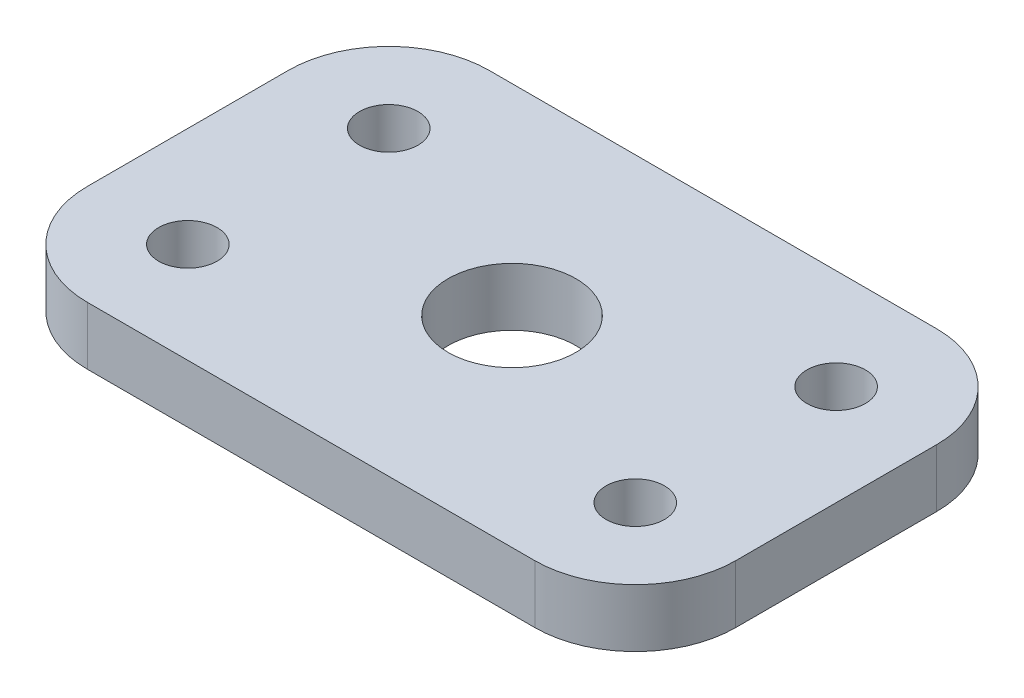
ISO-10303-21;
HEADER;
FILE_DESCRIPTION(('STEP AP214'),'2;1');
FILE_NAME('part.step','',(''),(''),'','','');
FILE_SCHEMA(('AUTOMOTIVE_DESIGN { 1 0 10303 214 1 1 1 1 }'));
ENDSEC;
DATA;
#1=APPLICATION_CONTEXT('core data for automotive mechanical design processes');
#2=APPLICATION_PROTOCOL_DEFINITION('international standard','automotive_design',2000,#1);
#3=PRODUCT_CONTEXT('',#1,'mechanical');
#4=PRODUCT('Part','Part','',(#3));
#5=PRODUCT_RELATED_PRODUCT_CATEGORY('part','',(#4));
#6=PRODUCT_DEFINITION_FORMATION('','',#4);
#7=PRODUCT_DEFINITION_CONTEXT('part definition',#1,'design');
#8=PRODUCT_DEFINITION('design','',#6,#7);
#9=PRODUCT_DEFINITION_SHAPE('','',#8);
#10=(LENGTH_UNIT() NAMED_UNIT(*) SI_UNIT(.MILLI.,.METRE.));
#11=(NAMED_UNIT(*) PLANE_ANGLE_UNIT() SI_UNIT($,.RADIAN.));
#12=(NAMED_UNIT(*) SI_UNIT($,.STERADIAN.) SOLID_ANGLE_UNIT());
#13=UNCERTAINTY_MEASURE_WITH_UNIT(LENGTH_MEASURE(1.E-05),#10,'distance_accuracy_value','');
#14=(GEOMETRIC_REPRESENTATION_CONTEXT(3) GLOBAL_UNCERTAINTY_ASSIGNED_CONTEXT((#13)) GLOBAL_UNIT_ASSIGNED_CONTEXT((#10,
#11,#12)) REPRESENTATION_CONTEXT('',''));
#15=CARTESIAN_POINT('',(0.,0.,0.));
#16=DIRECTION('',(0.,0.,1.));
#17=DIRECTION('',(1.,0.,0.));
#18=AXIS2_PLACEMENT_3D('',#15,#16,#17);
#19=CARTESIAN_POINT('',(0.,10.,0.));
#20=DIRECTION('',(0.,-1.,0.));
#21=DIRECTION('',(0.,0.,-1.));
#22=AXIS2_PLACEMENT_3D('',#19,#20,#21);
#23=PLANE('',#22);
#24=DIRECTION('',(1.,0.,0.));
#25=VECTOR('',#24,1.);
#26=CARTESIAN_POINT('',(-30.,10.,11.));
#27=LINE('',#26,#25);
#28=CARTESIAN_POINT('',(-24.5,10.,11.));
#29=VERTEX_POINT('',#28);
#30=CARTESIAN_POINT('',(0.,10.,11.));
#31=VERTEX_POINT('',#30);
#32=EDGE_CURVE('E145',#29,#31,#27,.T.);
#33=ORIENTED_EDGE('',*,*,#32,.T.);
#34=CARTESIAN_POINT('',(0.,10.,5.5));
#35=DIRECTION('',(0.,-1.,0.));
#36=DIRECTION('',(0.,0.,-1.));
#37=AXIS2_PLACEMENT_3D('',#34,#35,#36);
#38=CIRCLE('',#37,5.5);
#39=CARTESIAN_POINT('',(5.50000000000004,10.,5.5));
#40=VERTEX_POINT('',#39);
#41=EDGE_CURVE('E164',#31,#40,#38,.F.);
#42=ORIENTED_EDGE('',*,*,#41,.T.);
#43=DIRECTION('',(0.,0.,-1.));
#44=VECTOR('',#43,1.);
#45=CARTESIAN_POINT('',(5.50000000000004,10.,11.));
#46=LINE('',#45,#44);
#47=CARTESIAN_POINT('',(5.50000000000004,10.,-5.5));
#48=VERTEX_POINT('',#47);
#49=EDGE_CURVE('E128',#40,#48,#46,.T.);
#50=ORIENTED_EDGE('',*,*,#49,.T.);
#51=CARTESIAN_POINT('',(0.,10.,-5.5));
#52=DIRECTION('',(0.,-1.,0.));
#53=DIRECTION('',(0.,0.,-1.));
#54=AXIS2_PLACEMENT_3D('',#51,#52,#53);
#55=CIRCLE('',#54,5.5);
#56=CARTESIAN_POINT('',(0.,10.,-11.));
#57=VERTEX_POINT('',#56);
#58=EDGE_CURVE('E162',#48,#57,#55,.F.);
#59=ORIENTED_EDGE('',*,*,#58,.T.);
#60=DIRECTION('',(-1.,0.,0.));
#61=VECTOR('',#60,1.);
#62=CARTESIAN_POINT('',(-30.,10.,-11.));
#63=LINE('',#62,#61);
#64=CARTESIAN_POINT('',(-24.5,10.,-11.));
#65=VERTEX_POINT('',#64);
#66=EDGE_CURVE('E175',#57,#65,#63,.T.);
#67=ORIENTED_EDGE('',*,*,#66,.T.);
#68=CARTESIAN_POINT('',(-24.5,10.,-5.5));
#69=DIRECTION('',(0.,-1.,0.));
#70=DIRECTION('',(0.,0.,-1.));
#71=AXIS2_PLACEMENT_3D('',#68,#69,#70);
#72=CIRCLE('',#71,5.5);
#73=CARTESIAN_POINT('',(-30.,10.,-5.5));
#74=VERTEX_POINT('',#73);
#75=EDGE_CURVE('E63',#65,#74,#72,.F.);
#76=ORIENTED_EDGE('',*,*,#75,.T.);
#77=DIRECTION('',(0.,0.,1.));
#78=VECTOR('',#77,1.);
#79=CARTESIAN_POINT('',(-30.,10.,11.));
#80=LINE('',#79,#78);
#81=CARTESIAN_POINT('',(-30.,10.,5.5));
#82=VERTEX_POINT('',#81);
#83=EDGE_CURVE('E183',#74,#82,#80,.T.);
#84=ORIENTED_EDGE('',*,*,#83,.T.);
#85=CARTESIAN_POINT('',(-24.5,10.,5.5));
#86=DIRECTION('',(0.,-1.,0.));
#87=DIRECTION('',(0.,0.,-1.));
#88=AXIS2_PLACEMENT_3D('',#85,#86,#87);
#89=CIRCLE('',#88,5.5);
#90=EDGE_CURVE('E159',#82,#29,#89,.F.);
#91=ORIENTED_EDGE('',*,*,#90,.T.);
#92=EDGE_LOOP('',(#33,#42,#50,#59,#67,#76,#84,#91));
#93=FACE_BOUND('',#92,.T.);
#94=CARTESIAN_POINT('',(-24.5,10.,-5.49999999999962));
#95=DIRECTION('',(0.,1.,0.));
#96=DIRECTION('',(0.,0.,1.));
#97=AXIS2_PLACEMENT_3D('',#94,#95,#96);
#98=CIRCLE('',#97,1.6);
#99=CARTESIAN_POINT('',(-24.5,10.,-3.89999999999962));
#100=VERTEX_POINT('',#99);
#101=EDGE_CURVE('E136',#100,#100,#98,.T.);
#102=ORIENTED_EDGE('',*,*,#101,.F.);
#103=EDGE_LOOP('',(#102));
#104=FACE_BOUND('',#103,.T.);
#105=CARTESIAN_POINT('',(0.,10.,5.5));
#106=DIRECTION('',(0.,1.,0.));
#107=DIRECTION('',(0.,0.,1.));
#108=AXIS2_PLACEMENT_3D('',#105,#106,#107);
#109=CIRCLE('',#108,1.6);
#110=CARTESIAN_POINT('',(0.,10.,7.1));
#111=VERTEX_POINT('',#110);
#112=EDGE_CURVE('E190',#111,#111,#109,.T.);
#113=ORIENTED_EDGE('',*,*,#112,.F.);
#114=EDGE_LOOP('',(#113));
#115=FACE_BOUND('',#114,.T.);
#116=CARTESIAN_POINT('',(0.,10.,-5.5));
#117=DIRECTION('',(0.,1.,0.));
#118=DIRECTION('',(0.,0.,1.));
#119=AXIS2_PLACEMENT_3D('',#116,#117,#118);
#120=CIRCLE('',#119,1.6);
#121=CARTESIAN_POINT('',(0.,10.,-3.9));
#122=VERTEX_POINT('',#121);
#123=EDGE_CURVE('E195',#122,#122,#120,.T.);
#124=ORIENTED_EDGE('',*,*,#123,.F.);
#125=EDGE_LOOP('',(#124));
#126=FACE_BOUND('',#125,.T.);
#127=CARTESIAN_POINT('',(-24.5,10.,5.50000000000038));
#128=DIRECTION('',(0.,1.,0.));
#129=DIRECTION('',(0.,0.,1.));
#130=AXIS2_PLACEMENT_3D('',#127,#128,#129);
#131=CIRCLE('',#130,1.6);
#132=CARTESIAN_POINT('',(-24.5,10.,7.10000000000038));
#133=VERTEX_POINT('',#132);
#134=EDGE_CURVE('E201',#133,#133,#131,.T.);
#135=ORIENTED_EDGE('',*,*,#134,.F.);
#136=EDGE_LOOP('',(#135));
#137=FACE_BOUND('',#136,.T.);
#138=CARTESIAN_POINT('',(-12.25,10.,0.));
#139=DIRECTION('',(0.,1.,0.));
#140=DIRECTION('',(0.,0.,1.));
#141=AXIS2_PLACEMENT_3D('',#138,#139,#140);
#142=CIRCLE('',#141,3.5);
#143=CARTESIAN_POINT('',(-12.25,10.,3.5));
#144=VERTEX_POINT('',#143);
#145=EDGE_CURVE('E207',#144,#144,#142,.T.);
#146=ORIENTED_EDGE('',*,*,#145,.F.);
#147=EDGE_LOOP('',(#146));
#148=FACE_BOUND('',#147,.T.);
#149=ADVANCED_FACE('F42',(#93,#104,#115,#126,#137,#148),#23,.F.);
#150=CARTESIAN_POINT('',(0.,6.825,0.));
#151=DIRECTION('',(0.,-1.,0.));
#152=DIRECTION('',(0.,0.,-1.));
#153=AXIS2_PLACEMENT_3D('',#150,#151,#152);
#154=PLANE('',#153);
#155=CARTESIAN_POINT('',(-24.5,6.825,5.50000000000038));
#156=DIRECTION('',(0.,1.,0.));
#157=DIRECTION('',(0.,0.,1.));
#158=AXIS2_PLACEMENT_3D('',#155,#156,#157);
#159=CIRCLE('',#158,1.6);
#160=CARTESIAN_POINT('',(-24.5,6.825,7.10000000000038));
#161=VERTEX_POINT('',#160);
#162=EDGE_CURVE('E204',#161,#161,#159,.T.);
#163=ORIENTED_EDGE('',*,*,#162,.T.);
#164=EDGE_LOOP('',(#163));
#165=FACE_BOUND('',#164,.T.);
#166=CARTESIAN_POINT('',(0.,6.825,5.5));
#167=DIRECTION('',(0.,1.,0.));
#168=DIRECTION('',(0.,0.,1.));
#169=AXIS2_PLACEMENT_3D('',#166,#167,#168);
#170=CIRCLE('',#169,1.6);
#171=CARTESIAN_POINT('',(0.,6.825,7.1));
#172=VERTEX_POINT('',#171);
#173=EDGE_CURVE('E192',#172,#172,#170,.T.);
#174=ORIENTED_EDGE('',*,*,#173,.T.);
#175=EDGE_LOOP('',(#174));
#176=FACE_BOUND('',#175,.T.);
#177=DIRECTION('',(0.,0.,-1.));
#178=VECTOR('',#177,1.);
#179=CARTESIAN_POINT('',(5.50000000000004,6.825,11.));
#180=LINE('',#179,#178);
#181=CARTESIAN_POINT('',(5.50000000000004,6.825,5.5));
#182=VERTEX_POINT('',#181);
#183=CARTESIAN_POINT('',(5.50000000000004,6.825,-5.5));
#184=VERTEX_POINT('',#183);
#185=EDGE_CURVE('E125',#182,#184,#180,.T.);
#186=ORIENTED_EDGE('',*,*,#185,.F.);
#187=CARTESIAN_POINT('',(0.,6.825,5.5));
#188=DIRECTION('',(0.,-1.,0.));
#189=DIRECTION('',(0.,0.,-1.));
#190=AXIS2_PLACEMENT_3D('',#187,#188,#189);
#191=CIRCLE('',#190,5.5);
#192=CARTESIAN_POINT('',(0.,6.825,11.));
#193=VERTEX_POINT('',#192);
#194=EDGE_CURVE('E108',#182,#193,#191,.T.);
#195=ORIENTED_EDGE('',*,*,#194,.T.);
#196=DIRECTION('',(1.,0.,0.));
#197=VECTOR('',#196,1.);
#198=CARTESIAN_POINT('',(-30.,6.825,11.));
#199=LINE('',#198,#197);
#200=CARTESIAN_POINT('',(-24.5,6.825,11.));
#201=VERTEX_POINT('',#200);
#202=EDGE_CURVE('E149',#201,#193,#199,.T.);
#203=ORIENTED_EDGE('',*,*,#202,.F.);
#204=CARTESIAN_POINT('',(-24.5,6.825,5.5));
#205=DIRECTION('',(0.,-1.,0.));
#206=DIRECTION('',(0.,0.,-1.));
#207=AXIS2_PLACEMENT_3D('',#204,#205,#206);
#208=CIRCLE('',#207,5.5);
#209=CARTESIAN_POINT('',(-30.,6.825,5.5));
#210=VERTEX_POINT('',#209);
#211=EDGE_CURVE('E129',#201,#210,#208,.T.);
#212=ORIENTED_EDGE('',*,*,#211,.T.);
#213=DIRECTION('',(0.,0.,1.));
#214=VECTOR('',#213,1.);
#215=CARTESIAN_POINT('',(-30.,6.825,11.));
#216=LINE('',#215,#214);
#217=CARTESIAN_POINT('',(-30.,6.825,-5.5));
#218=VERTEX_POINT('',#217);
#219=EDGE_CURVE('E139',#218,#210,#216,.T.);
#220=ORIENTED_EDGE('',*,*,#219,.F.);
#221=CARTESIAN_POINT('',(-24.5,6.825,-5.5));
#222=DIRECTION('',(0.,-1.,0.));
#223=DIRECTION('',(0.,0.,-1.));
#224=AXIS2_PLACEMENT_3D('',#221,#222,#223);
#225=CIRCLE('',#224,5.5);
#226=CARTESIAN_POINT('',(-24.5,6.825,-11.));
#227=VERTEX_POINT('',#226);
#228=EDGE_CURVE('E153',#218,#227,#225,.T.);
#229=ORIENTED_EDGE('',*,*,#228,.T.);
#230=DIRECTION('',(-1.,0.,0.));
#231=VECTOR('',#230,1.);
#232=CARTESIAN_POINT('',(-30.,6.825,-11.));
#233=LINE('',#232,#231);
#234=CARTESIAN_POINT('',(0.,6.825,-11.));
#235=VERTEX_POINT('',#234);
#236=EDGE_CURVE('E135',#235,#227,#233,.T.);
#237=ORIENTED_EDGE('',*,*,#236,.F.);
#238=CARTESIAN_POINT('',(0.,6.825,-5.5));
#239=DIRECTION('',(0.,-1.,0.));
#240=DIRECTION('',(0.,0.,-1.));
#241=AXIS2_PLACEMENT_3D('',#238,#239,#240);
#242=CIRCLE('',#241,5.5);
#243=EDGE_CURVE('E119',#235,#184,#242,.T.);
#244=ORIENTED_EDGE('',*,*,#243,.T.);
#245=EDGE_LOOP('',(#186,#195,#203,#212,#220,#229,#237,#244));
#246=FACE_BOUND('',#245,.T.);
#247=CARTESIAN_POINT('',(-24.5,6.825,-5.49999999999962));
#248=DIRECTION('',(0.,1.,0.));
#249=DIRECTION('',(0.,0.,1.));
#250=AXIS2_PLACEMENT_3D('',#247,#248,#249);
#251=CIRCLE('',#250,1.6);
#252=CARTESIAN_POINT('',(-24.5,6.825,-3.89999999999962));
#253=VERTEX_POINT('',#252);
#254=EDGE_CURVE('E142',#253,#253,#251,.T.);
#255=ORIENTED_EDGE('',*,*,#254,.T.);
#256=EDGE_LOOP('',(#255));
#257=FACE_BOUND('',#256,.T.);
#258=CARTESIAN_POINT('',(0.,6.825,-5.5));
#259=DIRECTION('',(0.,1.,0.));
#260=DIRECTION('',(0.,0.,1.));
#261=AXIS2_PLACEMENT_3D('',#258,#259,#260);
#262=CIRCLE('',#261,1.6);
#263=CARTESIAN_POINT('',(0.,6.825,-3.9));
#264=VERTEX_POINT('',#263);
#265=EDGE_CURVE('E198',#264,#264,#262,.T.);
#266=ORIENTED_EDGE('',*,*,#265,.T.);
#267=EDGE_LOOP('',(#266));
#268=FACE_BOUND('',#267,.T.);
#269=CARTESIAN_POINT('',(-12.25,6.825,0.));
#270=DIRECTION('',(0.,1.,0.));
#271=DIRECTION('',(0.,0.,1.));
#272=AXIS2_PLACEMENT_3D('',#269,#270,#271);
#273=CIRCLE('',#272,3.5);
#274=CARTESIAN_POINT('',(-12.25,6.825,3.5));
#275=VERTEX_POINT('',#274);
#276=EDGE_CURVE('E210',#275,#275,#273,.T.);
#277=ORIENTED_EDGE('',*,*,#276,.T.);
#278=EDGE_LOOP('',(#277));
#279=FACE_BOUND('',#278,.T.);
#280=ADVANCED_FACE('F132',(#165,#176,#246,#257,#268,#279),#154,.T.);
#281=CARTESIAN_POINT('',(5.50000000000004,10.,11.));
#282=DIRECTION('',(-1.,0.,0.));
#283=DIRECTION('',(0.,0.,1.));
#284=AXIS2_PLACEMENT_3D('',#281,#282,#283);
#285=PLANE('',#284);
#286=ORIENTED_EDGE('',*,*,#49,.F.);
#287=DIRECTION('',(0.,-1.,0.));
#288=VECTOR('',#287,1.);
#289=CARTESIAN_POINT('',(5.50000000000004,10.,5.5));
#290=LINE('',#289,#288);
#291=EDGE_CURVE('E112',#40,#182,#290,.T.);
#292=ORIENTED_EDGE('',*,*,#291,.T.);
#293=ORIENTED_EDGE('',*,*,#185,.T.);
#294=DIRECTION('',(0.,-1.,0.));
#295=VECTOR('',#294,1.);
#296=CARTESIAN_POINT('',(5.50000000000004,10.,-5.5));
#297=LINE('',#296,#295);
#298=EDGE_CURVE('E130',#184,#48,#297,.F.);
#299=ORIENTED_EDGE('',*,*,#298,.T.);
#300=EDGE_LOOP('',(#286,#292,#293,#299));
#301=FACE_BOUND('',#300,.T.);
#302=ADVANCED_FACE('F124',(#301),#285,.F.);
#303=CARTESIAN_POINT('',(-30.,10.,-11.));
#304=DIRECTION('',(0.,0.,1.));
#305=DIRECTION('',(0.,-1.,0.));
#306=AXIS2_PLACEMENT_3D('',#303,#304,#305);
#307=PLANE('',#306);
#308=ORIENTED_EDGE('',*,*,#66,.F.);
#309=DIRECTION('',(0.,-1.,0.));
#310=VECTOR('',#309,1.);
#311=CARTESIAN_POINT('',(0.,10.,-11.));
#312=LINE('',#311,#310);
#313=EDGE_CURVE('E168',#57,#235,#312,.T.);
#314=ORIENTED_EDGE('',*,*,#313,.T.);
#315=ORIENTED_EDGE('',*,*,#236,.T.);
#316=DIRECTION('',(0.,-1.,0.));
#317=VECTOR('',#316,1.);
#318=CARTESIAN_POINT('',(-24.5,10.,-11.));
#319=LINE('',#318,#317);
#320=EDGE_CURVE('E166',#227,#65,#319,.F.);
#321=ORIENTED_EDGE('',*,*,#320,.T.);
#322=EDGE_LOOP('',(#308,#314,#315,#321));
#323=FACE_BOUND('',#322,.T.);
#324=ADVANCED_FACE('F173',(#323),#307,.F.);
#325=CARTESIAN_POINT('',(-30.,10.,11.));
#326=DIRECTION('',(1.,0.,0.));
#327=DIRECTION('',(0.,0.,-1.));
#328=AXIS2_PLACEMENT_3D('',#325,#326,#327);
#329=PLANE('',#328);
#330=ORIENTED_EDGE('',*,*,#83,.F.);
#331=DIRECTION('',(0.,-1.,0.));
#332=VECTOR('',#331,1.);
#333=CARTESIAN_POINT('',(-30.,10.,-5.5));
#334=LINE('',#333,#332);
#335=EDGE_CURVE('E12',#74,#218,#334,.T.);
#336=ORIENTED_EDGE('',*,*,#335,.T.);
#337=ORIENTED_EDGE('',*,*,#219,.T.);
#338=DIRECTION('',(0.,-1.,0.));
#339=VECTOR('',#338,1.);
#340=CARTESIAN_POINT('',(-30.,10.,5.5));
#341=LINE('',#340,#339);
#342=EDGE_CURVE('E50',#210,#82,#341,.F.);
#343=ORIENTED_EDGE('',*,*,#342,.T.);
#344=EDGE_LOOP('',(#330,#336,#337,#343));
#345=FACE_BOUND('',#344,.T.);
#346=ADVANCED_FACE('F182',(#345),#329,.F.);
#347=CARTESIAN_POINT('',(-30.,10.,11.));
#348=DIRECTION('',(0.,0.,-1.));
#349=DIRECTION('',(0.,1.,0.));
#350=AXIS2_PLACEMENT_3D('',#347,#348,#349);
#351=PLANE('',#350);
#352=ORIENTED_EDGE('',*,*,#202,.T.);
#353=DIRECTION('',(0.,-1.,0.));
#354=VECTOR('',#353,1.);
#355=CARTESIAN_POINT('',(0.,10.,11.));
#356=LINE('',#355,#354);
#357=EDGE_CURVE('E113',#193,#31,#356,.F.);
#358=ORIENTED_EDGE('',*,*,#357,.T.);
#359=ORIENTED_EDGE('',*,*,#32,.F.);
#360=DIRECTION('',(0.,-1.,0.));
#361=VECTOR('',#360,1.);
#362=CARTESIAN_POINT('',(-24.5,10.,11.));
#363=LINE('',#362,#361);
#364=EDGE_CURVE('E118',#29,#201,#363,.T.);
#365=ORIENTED_EDGE('',*,*,#364,.T.);
#366=EDGE_LOOP('',(#352,#358,#359,#365));
#367=FACE_BOUND('',#366,.T.);
#368=ADVANCED_FACE('F231',(#367),#351,.F.);
#369=CARTESIAN_POINT('',(-24.5,10.,-5.49999999999962));
#370=DIRECTION('',(0.,-1.,0.));
#371=DIRECTION('',(0.,0.,-1.));
#372=AXIS2_PLACEMENT_3D('',#369,#370,#371);
#373=CYLINDRICAL_SURFACE('',#372,1.6);
#374=ORIENTED_EDGE('',*,*,#101,.T.);
#375=EDGE_LOOP('',(#374));
#376=FACE_BOUND('',#375,.T.);
#377=ORIENTED_EDGE('',*,*,#254,.F.);
#378=EDGE_LOOP('',(#377));
#379=FACE_BOUND('',#378,.T.);
#380=ADVANCED_FACE('F228',(#376,#379),#373,.F.);
#381=CARTESIAN_POINT('',(0.,10.,5.5));
#382=DIRECTION('',(0.,-1.,0.));
#383=DIRECTION('',(0.,0.,-1.));
#384=AXIS2_PLACEMENT_3D('',#381,#382,#383);
#385=CYLINDRICAL_SURFACE('',#384,1.6);
#386=ORIENTED_EDGE('',*,*,#112,.T.);
#387=EDGE_LOOP('',(#386));
#388=FACE_BOUND('',#387,.T.);
#389=ORIENTED_EDGE('',*,*,#173,.F.);
#390=EDGE_LOOP('',(#389));
#391=FACE_BOUND('',#390,.T.);
#392=ADVANCED_FACE('F334',(#388,#391),#385,.F.);
#393=CARTESIAN_POINT('',(0.,10.,-5.5));
#394=DIRECTION('',(0.,-1.,0.));
#395=DIRECTION('',(0.,0.,-1.));
#396=AXIS2_PLACEMENT_3D('',#393,#394,#395);
#397=CYLINDRICAL_SURFACE('',#396,1.6);
#398=ORIENTED_EDGE('',*,*,#123,.T.);
#399=EDGE_LOOP('',(#398));
#400=FACE_BOUND('',#399,.T.);
#401=ORIENTED_EDGE('',*,*,#265,.F.);
#402=EDGE_LOOP('',(#401));
#403=FACE_BOUND('',#402,.T.);
#404=ADVANCED_FACE('F324',(#400,#403),#397,.F.);
#405=CARTESIAN_POINT('',(-24.5,10.,5.50000000000038));
#406=DIRECTION('',(0.,-1.,0.));
#407=DIRECTION('',(0.,0.,-1.));
#408=AXIS2_PLACEMENT_3D('',#405,#406,#407);
#409=CYLINDRICAL_SURFACE('',#408,1.6);
#410=ORIENTED_EDGE('',*,*,#134,.T.);
#411=EDGE_LOOP('',(#410));
#412=FACE_BOUND('',#411,.T.);
#413=ORIENTED_EDGE('',*,*,#162,.F.);
#414=EDGE_LOOP('',(#413));
#415=FACE_BOUND('',#414,.T.);
#416=ADVANCED_FACE('F315',(#412,#415),#409,.F.);
#417=CARTESIAN_POINT('',(-12.25,10.,0.));
#418=DIRECTION('',(0.,-1.,0.));
#419=DIRECTION('',(0.,0.,-1.));
#420=AXIS2_PLACEMENT_3D('',#417,#418,#419);
#421=CYLINDRICAL_SURFACE('',#420,3.5);
#422=ORIENTED_EDGE('',*,*,#145,.T.);
#423=EDGE_LOOP('',(#422));
#424=FACE_BOUND('',#423,.T.);
#425=ORIENTED_EDGE('',*,*,#276,.F.);
#426=EDGE_LOOP('',(#425));
#427=FACE_BOUND('',#426,.T.);
#428=ADVANCED_FACE('F216',(#424,#427),#421,.F.);
#429=CARTESIAN_POINT('',(0.,10.,5.5));
#430=DIRECTION('',(0.,-1.,0.));
#431=DIRECTION('',(0.,0.,-1.));
#432=AXIS2_PLACEMENT_3D('',#429,#430,#431);
#433=CYLINDRICAL_SURFACE('',#432,5.5);
#434=ORIENTED_EDGE('',*,*,#41,.F.);
#435=ORIENTED_EDGE('',*,*,#357,.F.);
#436=ORIENTED_EDGE('',*,*,#194,.F.);
#437=ORIENTED_EDGE('',*,*,#291,.F.);
#438=EDGE_LOOP('',(#434,#435,#436,#437));
#439=FACE_BOUND('',#438,.T.);
#440=ADVANCED_FACE('F111',(#439),#433,.T.);
#441=CARTESIAN_POINT('',(0.,10.,-5.5));
#442=DIRECTION('',(0.,-1.,0.));
#443=DIRECTION('',(0.,0.,-1.));
#444=AXIS2_PLACEMENT_3D('',#441,#442,#443);
#445=CYLINDRICAL_SURFACE('',#444,5.5);
#446=ORIENTED_EDGE('',*,*,#58,.F.);
#447=ORIENTED_EDGE('',*,*,#298,.F.);
#448=ORIENTED_EDGE('',*,*,#243,.F.);
#449=ORIENTED_EDGE('',*,*,#313,.F.);
#450=EDGE_LOOP('',(#446,#447,#448,#449));
#451=FACE_BOUND('',#450,.T.);
#452=ADVANCED_FACE('F243',(#451),#445,.T.);
#453=CARTESIAN_POINT('',(-24.5,10.,-5.5));
#454=DIRECTION('',(0.,-1.,0.));
#455=DIRECTION('',(0.,0.,-1.));
#456=AXIS2_PLACEMENT_3D('',#453,#454,#455);
#457=CYLINDRICAL_SURFACE('',#456,5.5);
#458=ORIENTED_EDGE('',*,*,#75,.F.);
#459=ORIENTED_EDGE('',*,*,#320,.F.);
#460=ORIENTED_EDGE('',*,*,#228,.F.);
#461=ORIENTED_EDGE('',*,*,#335,.F.);
#462=EDGE_LOOP('',(#458,#459,#460,#461));
#463=FACE_BOUND('',#462,.T.);
#464=ADVANCED_FACE('F181',(#463),#457,.T.);
#465=CARTESIAN_POINT('',(-24.5,10.,5.5));
#466=DIRECTION('',(0.,-1.,0.));
#467=DIRECTION('',(0.,0.,-1.));
#468=AXIS2_PLACEMENT_3D('',#465,#466,#467);
#469=CYLINDRICAL_SURFACE('',#468,5.5);
#470=ORIENTED_EDGE('',*,*,#90,.F.);
#471=ORIENTED_EDGE('',*,*,#342,.F.);
#472=ORIENTED_EDGE('',*,*,#211,.F.);
#473=ORIENTED_EDGE('',*,*,#364,.F.);
#474=EDGE_LOOP('',(#470,#471,#472,#473));
#475=FACE_BOUND('',#474,.T.);
#476=ADVANCED_FACE('F44',(#475),#469,.T.);
#477=CLOSED_SHELL('',(#149,#280,#302,#324,#346,#368,#380,#392,#404,#416,#428,#440,#452,#464,#476));
#478=MANIFOLD_SOLID_BREP('B2',#477);
#479=ADVANCED_BREP_SHAPE_REPRESENTATION('',(#18,#478),#14);
#480=SHAPE_DEFINITION_REPRESENTATION(#9,#479);
ENDSEC;
END-ISO-10303-21;
